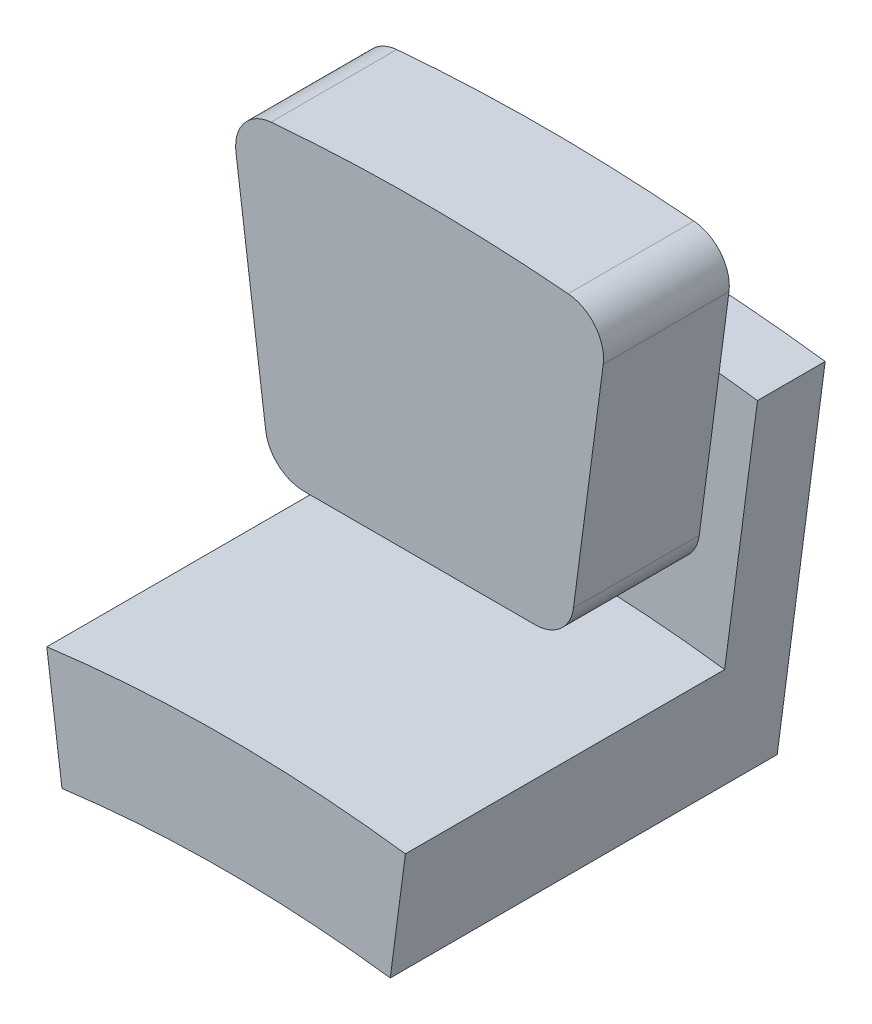
ISO-10303-21;
HEADER;
FILE_DESCRIPTION(('STEP AP214'),'2;1');
FILE_NAME('part.step','',(''),(''),'','','');
FILE_SCHEMA(('AUTOMOTIVE_DESIGN { 1 0 10303 214 1 1 1 1 }'));
ENDSEC;
DATA;
#1=APPLICATION_CONTEXT('core data for automotive mechanical design processes');
#2=APPLICATION_PROTOCOL_DEFINITION('international standard','automotive_design',2000,#1);
#3=PRODUCT_CONTEXT('',#1,'mechanical');
#4=PRODUCT('Part','Part','',(#3));
#5=PRODUCT_RELATED_PRODUCT_CATEGORY('part','',(#4));
#6=PRODUCT_DEFINITION_FORMATION('','',#4);
#7=PRODUCT_DEFINITION_CONTEXT('part definition',#1,'design');
#8=PRODUCT_DEFINITION('design','',#6,#7);
#9=PRODUCT_DEFINITION_SHAPE('','',#8);
#10=(LENGTH_UNIT() NAMED_UNIT(*) SI_UNIT(.MILLI.,.METRE.));
#11=(NAMED_UNIT(*) PLANE_ANGLE_UNIT() SI_UNIT($,.RADIAN.));
#12=(NAMED_UNIT(*) SI_UNIT($,.STERADIAN.) SOLID_ANGLE_UNIT());
#13=UNCERTAINTY_MEASURE_WITH_UNIT(LENGTH_MEASURE(1.E-05),#10,'distance_accuracy_value','');
#14=(GEOMETRIC_REPRESENTATION_CONTEXT(3) GLOBAL_UNCERTAINTY_ASSIGNED_CONTEXT((#13)) GLOBAL_UNIT_ASSIGNED_CONTEXT((#10,
#11,#12)) REPRESENTATION_CONTEXT('',''));
#15=CARTESIAN_POINT('',(0.,0.,0.));
#16=DIRECTION('',(0.,0.,1.));
#17=DIRECTION('',(1.,0.,0.));
#18=AXIS2_PLACEMENT_3D('',#15,#16,#17);
#19=CARTESIAN_POINT('',(-8.9782022166874,83.5188115633614,52.1600087497283));
#20=DIRECTION('',(0.991444861373809,0.130526192220059,0.));
#21=DIRECTION('',(-0.130526192220059,0.991444861373809,0.));
#22=AXIS2_PLACEMENT_3D('',#19,#20,#21);
#23=PLANE('',#22);
#24=DIRECTION('',(-0.130526192220052,0.99144486137381,0.));
#25=VECTOR('',#24,1.);
#26=CARTESIAN_POINT('',(-9.76156663682273,89.4690550793674,10.));
#27=LINE('',#26,#25);
#28=CARTESIAN_POINT('',(-7.95396369706912,75.7389476155599,10.));
#29=VERTEX_POINT('',#28);
#30=CARTESIAN_POINT('',(-9.4915430396612,87.4180222306949,10.));
#31=VERTEX_POINT('',#30);
#32=EDGE_CURVE('E199',#29,#31,#27,.T.);
#33=ORIENTED_EDGE('',*,*,#32,.T.);
#34=DIRECTION('',(0.,0.,-1.));
#35=VECTOR('',#34,1.);
#36=CARTESIAN_POINT('',(-9.49154303966129,87.4180222306948,52.1600087497283));
#37=LINE('',#36,#35);
#38=CARTESIAN_POINT('',(-9.49154303966119,87.4180222306949,3.50000000000002));
#39=VERTEX_POINT('',#38);
#40=EDGE_CURVE('E243',#31,#39,#37,.T.);
#41=ORIENTED_EDGE('',*,*,#40,.T.);
#42=DIRECTION('',(-0.130526192220052,0.99144486137381,0.));
#43=VECTOR('',#42,1.);
#44=CARTESIAN_POINT('',(-9.76156663682272,89.4690550793674,3.50000000000002));
#45=LINE('',#44,#43);
#46=CARTESIAN_POINT('',(-8.97820221668733,83.5188115633614,3.50000000000002));
#47=VERTEX_POINT('',#46);
#48=EDGE_CURVE('E222',#47,#39,#45,.T.);
#49=ORIENTED_EDGE('',*,*,#48,.F.);
#50=DIRECTION('',(-0.130526192220052,0.99144486137381,0.));
#51=VECTOR('',#50,1.);
#52=CARTESIAN_POINT('',(-7.72502690030701,74.,3.50000000000002));
#53=LINE('',#52,#51);
#54=CARTESIAN_POINT('',(-7.95396369706912,75.7389476155599,3.50000000000002));
#55=VERTEX_POINT('',#54);
#56=EDGE_CURVE('E183',#55,#47,#53,.T.);
#57=ORIENTED_EDGE('',*,*,#56,.F.);
#58=DIRECTION('',(0.,0.,-1.));
#59=VECTOR('',#58,1.);
#60=CARTESIAN_POINT('',(-7.95396369706914,75.7389476155599,52.1600087497283));
#61=LINE('',#60,#59);
#62=EDGE_CURVE('E235',#55,#29,#61,.F.);
#63=ORIENTED_EDGE('',*,*,#62,.T.);
#64=EDGE_LOOP('',(#33,#41,#49,#57,#63));
#65=FACE_BOUND('',#64,.T.);
#66=ADVANCED_FACE('F42',(#65),#23,.F.);
#67=CARTESIAN_POINT('',(8.9782022166874,83.5188115633614,52.1600087497283));
#68=DIRECTION('',(-0.991444861373812,0.13052619222004,0.));
#69=DIRECTION('',(-0.13052619222004,-0.991444861373812,0.));
#70=AXIS2_PLACEMENT_3D('',#67,#68,#69);
#71=PLANE('',#70);
#72=DIRECTION('',(-0.130526192220052,-0.99144486137381,0.));
#73=VECTOR('',#72,1.);
#74=CARTESIAN_POINT('',(9.76156663682273,89.4690550793674,3.50000000000002));
#75=LINE('',#74,#73);
#76=CARTESIAN_POINT('',(9.4915430396612,87.4180222306949,3.50000000000002));
#77=VERTEX_POINT('',#76);
#78=CARTESIAN_POINT('',(8.97820221668732,83.5188115633614,3.50000000000002));
#79=VERTEX_POINT('',#78);
#80=EDGE_CURVE('E173',#77,#79,#75,.T.);
#81=ORIENTED_EDGE('',*,*,#80,.F.);
#82=DIRECTION('',(0.,0.,-1.));
#83=VECTOR('',#82,1.);
#84=CARTESIAN_POINT('',(9.49154303966123,87.4180222306949,52.1600087497283));
#85=LINE('',#84,#83);
#86=CARTESIAN_POINT('',(9.4915430396612,87.4180222306949,10.));
#87=VERTEX_POINT('',#86);
#88=EDGE_CURVE('E266',#77,#87,#85,.F.);
#89=ORIENTED_EDGE('',*,*,#88,.T.);
#90=DIRECTION('',(-0.130526192220051,-0.99144486137381,0.));
#91=VECTOR('',#90,1.);
#92=CARTESIAN_POINT('',(7.72502690030703,74.,10.));
#93=LINE('',#92,#91);
#94=CARTESIAN_POINT('',(7.95396369706914,75.73894761556,10.));
#95=VERTEX_POINT('',#94);
#96=EDGE_CURVE('E193',#87,#95,#93,.T.);
#97=ORIENTED_EDGE('',*,*,#96,.T.);
#98=DIRECTION('',(0.,0.,-1.));
#99=VECTOR('',#98,1.);
#100=CARTESIAN_POINT('',(7.95396369706929,75.7389476155599,52.1600087497283));
#101=LINE('',#100,#99);
#102=CARTESIAN_POINT('',(7.95396369706914,75.73894761556,3.50000000000002));
#103=VERTEX_POINT('',#102);
#104=EDGE_CURVE('E263',#95,#103,#101,.T.);
#105=ORIENTED_EDGE('',*,*,#104,.T.);
#106=DIRECTION('',(-0.130526192220051,-0.99144486137381,0.));
#107=VECTOR('',#106,1.);
#108=CARTESIAN_POINT('',(7.72502690030703,74.,3.50000000000002));
#109=LINE('',#108,#107);
#110=EDGE_CURVE('E188',#79,#103,#109,.T.);
#111=ORIENTED_EDGE('',*,*,#110,.F.);
#112=EDGE_LOOP('',(#81,#89,#97,#105,#111));
#113=FACE_BOUND('',#112,.T.);
#114=ADVANCED_FACE('F293',(#113),#71,.F.);
#115=CARTESIAN_POINT('',(0.,0.,52.1600087497283));
#116=DIRECTION('',(0.,0.,-1.));
#117=DIRECTION('',(-1.,0.,0.));
#118=AXIS2_PLACEMENT_3D('',#115,#116,#117);
#119=CYLINDRICAL_SURFACE('',#118,90.);
#120=CARTESIAN_POINT('',(0.,0.,3.50000000000002));
#121=DIRECTION('',(0.,0.,1.));
#122=DIRECTION('',(1.,0.,0.));
#123=AXIS2_PLACEMENT_3D('',#120,#121,#122);
#124=CIRCLE('',#123,90.);
#125=CARTESIAN_POINT('',(-7.67930452866172,89.671780856388,3.50000000000002));
#126=VERTEX_POINT('',#125);
#127=CARTESIAN_POINT('',(7.67930452866164,89.6717808563881,3.50000000000002));
#128=VERTEX_POINT('',#127);
#129=EDGE_CURVE('E161',#126,#128,#124,.F.);
#130=ORIENTED_EDGE('',*,*,#129,.F.);
#131=DIRECTION('',(0.,0.,-1.));
#132=VECTOR('',#131,1.);
#133=CARTESIAN_POINT('',(-7.67930452866172,89.6717808563881,52.1600087497283));
#134=LINE('',#133,#132);
#135=CARTESIAN_POINT('',(-7.67930452866172,89.671780856388,10.));
#136=VERTEX_POINT('',#135);
#137=EDGE_CURVE('E253',#126,#136,#134,.F.);
#138=ORIENTED_EDGE('',*,*,#137,.T.);
#139=CARTESIAN_POINT('',(0.,0.,10.));
#140=DIRECTION('',(0.,0.,1.));
#141=DIRECTION('',(1.,0.,0.));
#142=AXIS2_PLACEMENT_3D('',#139,#140,#141);
#143=CIRCLE('',#142,90.);
#144=CARTESIAN_POINT('',(7.67930452866164,89.6717808563881,10.));
#145=VERTEX_POINT('',#144);
#146=EDGE_CURVE('E196',#136,#145,#143,.F.);
#147=ORIENTED_EDGE('',*,*,#146,.T.);
#148=DIRECTION('',(0.,0.,-1.));
#149=VECTOR('',#148,1.);
#150=CARTESIAN_POINT('',(7.67930452866164,89.6717808563881,52.1600087497283));
#151=LINE('',#150,#149);
#152=EDGE_CURVE('E250',#145,#128,#151,.T.);
#153=ORIENTED_EDGE('',*,*,#152,.T.);
#154=EDGE_LOOP('',(#130,#138,#147,#153));
#155=FACE_BOUND('',#154,.T.);
#156=ADVANCED_FACE('F302',(#155),#119,.T.);
#157=CARTESIAN_POINT('',(7.72502690030703,74.,-16.2550149550945));
#158=DIRECTION('',(0.,1.,0.));
#159=DIRECTION('',(0.,0.,1.));
#160=AXIS2_PLACEMENT_3D('',#157,#158,#159);
#161=PLANE('',#160);
#162=DIRECTION('',(-1.,0.,0.));
#163=VECTOR('',#162,1.);
#164=CARTESIAN_POINT('',(-7.72502690030701,74.,10.));
#165=LINE('',#164,#163);
#166=CARTESIAN_POINT('',(5.97107397432167,74.,10.));
#167=VERTEX_POINT('',#166);
#168=CARTESIAN_POINT('',(-5.97107397432152,74.,10.));
#169=VERTEX_POINT('',#168);
#170=EDGE_CURVE('E202',#167,#169,#165,.T.);
#171=ORIENTED_EDGE('',*,*,#170,.T.);
#172=DIRECTION('',(0.,0.,-1.));
#173=VECTOR('',#172,1.);
#174=CARTESIAN_POINT('',(-5.97107397432152,74.,-16.2550149550945));
#175=LINE('',#174,#173);
#176=CARTESIAN_POINT('',(-5.97107397432152,74.,3.50000000000002));
#177=VERTEX_POINT('',#176);
#178=EDGE_CURVE('E270',#169,#177,#175,.T.);
#179=ORIENTED_EDGE('',*,*,#178,.T.);
#180=DIRECTION('',(1.,0.,0.));
#181=VECTOR('',#180,1.);
#182=CARTESIAN_POINT('',(7.72502690030703,74.,3.50000000000002));
#183=LINE('',#182,#181);
#184=CARTESIAN_POINT('',(5.97107397432167,74.,3.50000000000002));
#185=VERTEX_POINT('',#184);
#186=EDGE_CURVE('E213',#177,#185,#183,.T.);
#187=ORIENTED_EDGE('',*,*,#186,.T.);
#188=DIRECTION('',(0.,0.,-1.));
#189=VECTOR('',#188,1.);
#190=CARTESIAN_POINT('',(5.97107397432167,74.,-16.2550149550945));
#191=LINE('',#190,#189);
#192=EDGE_CURVE('E268',#185,#167,#191,.F.);
#193=ORIENTED_EDGE('',*,*,#192,.T.);
#194=EDGE_LOOP('',(#171,#179,#187,#193));
#195=FACE_BOUND('',#194,.T.);
#196=ADVANCED_FACE('F285',(#195),#161,.F.);
#197=CARTESIAN_POINT('',(0.,0.,20.));
#198=DIRECTION('',(0.,0.,1.));
#199=DIRECTION('',(1.,0.,0.));
#200=AXIS2_PLACEMENT_3D('',#197,#198,#199);
#201=PLANE('',#200);
#202=CARTESIAN_POINT('',(0.,0.,20.));
#203=DIRECTION('',(0.,0.,-1.));
#204=DIRECTION('',(1.,0.,0.));
#205=AXIS2_PLACEMENT_3D('',#202,#203,#204);
#206=CIRCLE('',#205,71.);
#207=CARTESIAN_POINT('',(-9.26735964762369,70.3925851575405,20.));
#208=VERTEX_POINT('',#207);
#209=CARTESIAN_POINT('',(9.2673596476237,70.3925851575405,20.));
#210=VERTEX_POINT('',#209);
#211=EDGE_CURVE('E205',#208,#210,#206,.T.);
#212=ORIENTED_EDGE('',*,*,#211,.F.);
#213=DIRECTION('',(0.130526192220052,-0.99144486137381,0.));
#214=VECTOR('',#213,1.);
#215=CARTESIAN_POINT('',(-8.48420249430338,64.4439159892977,20.));
#216=LINE('',#215,#214);
#217=CARTESIAN_POINT('',(-8.48420249430338,64.4439159892977,20.));
#218=VERTEX_POINT('',#217);
#219=EDGE_CURVE('E229',#208,#218,#216,.T.);
#220=ORIENTED_EDGE('',*,*,#219,.T.);
#221=CARTESIAN_POINT('',(0.,0.,20.));
#222=DIRECTION('',(0.,0.,1.));
#223=DIRECTION('',(1.,0.,0.));
#224=AXIS2_PLACEMENT_3D('',#221,#222,#223);
#225=CIRCLE('',#224,65.);
#226=CARTESIAN_POINT('',(8.48420249430338,64.4439159892977,20.));
#227=VERTEX_POINT('',#226);
#228=EDGE_CURVE('E236',#218,#227,#225,.F.);
#229=ORIENTED_EDGE('',*,*,#228,.T.);
#230=DIRECTION('',(0.130526192220052,0.99144486137381,0.));
#231=VECTOR('',#230,1.);
#232=CARTESIAN_POINT('',(8.48420249430338,64.4439159892977,20.));
#233=LINE('',#232,#231);
#234=EDGE_CURVE('E232',#227,#210,#233,.T.);
#235=ORIENTED_EDGE('',*,*,#234,.T.);
#236=EDGE_LOOP('',(#212,#220,#229,#235));
#237=FACE_BOUND('',#236,.T.);
#238=ADVANCED_FACE('F318',(#237),#201,.T.);
#239=CARTESIAN_POINT('',(-8.48420249430338,64.4439159892977,52.1600087497283));
#240=DIRECTION('',(0.99144486137381,0.130526192220052,0.));
#241=DIRECTION('',(-0.130526192220052,0.99144486137381,0.));
#242=AXIS2_PLACEMENT_3D('',#239,#240,#241);
#243=PLANE('',#242);
#244=ORIENTED_EDGE('',*,*,#219,.F.);
#245=DIRECTION('',(0.,0.,1.));
#246=VECTOR('',#245,1.);
#247=CARTESIAN_POINT('',(-9.26735964762369,70.3925851575405,-16.2550149550945));
#248=LINE('',#247,#246);
#249=CARTESIAN_POINT('',(-9.26735964762369,70.3925851575405,3.50000000000002));
#250=VERTEX_POINT('',#249);
#251=EDGE_CURVE('E215',#250,#208,#248,.T.);
#252=ORIENTED_EDGE('',*,*,#251,.F.);
#253=DIRECTION('',(-0.130526192220054,0.99144486137381,0.));
#254=VECTOR('',#253,1.);
#255=CARTESIAN_POINT('',(-9.26735964762369,70.3925851575405,3.50000000000002));
#256=LINE('',#255,#254);
#257=CARTESIAN_POINT('',(-10.9642001464844,83.2813683554001,3.50000000000002));
#258=VERTEX_POINT('',#257);
#259=EDGE_CURVE('E180',#250,#258,#256,.T.);
#260=ORIENTED_EDGE('',*,*,#259,.T.);
#261=DIRECTION('',(0.,0.,1.));
#262=VECTOR('',#261,1.);
#263=CARTESIAN_POINT('',(-10.9642001464844,83.2813683554001,-10.2770283892811));
#264=LINE('',#263,#262);
#265=CARTESIAN_POINT('',(-10.9642001464844,83.2813683554001,0.));
#266=VERTEX_POINT('',#265);
#267=EDGE_CURVE('E168',#266,#258,#264,.T.);
#268=ORIENTED_EDGE('',*,*,#267,.F.);
#269=DIRECTION('',(0.130526192220052,-0.99144486137381,0.));
#270=VECTOR('',#269,1.);
#271=CARTESIAN_POINT('',(-8.48420249430338,64.4439159892977,0.));
#272=LINE('',#271,#270);
#273=CARTESIAN_POINT('',(-8.48420249430338,64.4439159892977,0.));
#274=VERTEX_POINT('',#273);
#275=EDGE_CURVE('E149',#266,#274,#272,.T.);
#276=ORIENTED_EDGE('',*,*,#275,.T.);
#277=DIRECTION('',(0.,0.,-1.));
#278=VECTOR('',#277,1.);
#279=CARTESIAN_POINT('',(-8.48420249430338,64.4439159892977,52.1600087497283));
#280=LINE('',#279,#278);
#281=EDGE_CURVE('E160',#218,#274,#280,.T.);
#282=ORIENTED_EDGE('',*,*,#281,.F.);
#283=EDGE_LOOP('',(#244,#252,#260,#268,#276,#282));
#284=FACE_BOUND('',#283,.T.);
#285=ADVANCED_FACE('F177',(#284),#243,.F.);
#286=CARTESIAN_POINT('',(0.,0.,52.1600087497283));
#287=DIRECTION('',(0.,0.,-1.));
#288=DIRECTION('',(-1.,0.,0.));
#289=AXIS2_PLACEMENT_3D('',#286,#287,#288);
#290=CYLINDRICAL_SURFACE('',#289,65.);
#291=ORIENTED_EDGE('',*,*,#228,.F.);
#292=ORIENTED_EDGE('',*,*,#281,.T.);
#293=CARTESIAN_POINT('',(0.,0.,0.));
#294=DIRECTION('',(0.,0.,-1.));
#295=DIRECTION('',(-1.,0.,0.));
#296=AXIS2_PLACEMENT_3D('',#293,#294,#295);
#297=CIRCLE('',#296,65.);
#298=CARTESIAN_POINT('',(8.48420249430338,64.4439159892977,0.));
#299=VERTEX_POINT('',#298);
#300=EDGE_CURVE('E156',#274,#299,#297,.T.);
#301=ORIENTED_EDGE('',*,*,#300,.T.);
#302=DIRECTION('',(0.,0.,-1.));
#303=VECTOR('',#302,1.);
#304=CARTESIAN_POINT('',(8.48420249430338,64.4439159892977,52.1600087497283));
#305=LINE('',#304,#303);
#306=EDGE_CURVE('E230',#227,#299,#305,.T.);
#307=ORIENTED_EDGE('',*,*,#306,.F.);
#308=EDGE_LOOP('',(#291,#292,#301,#307));
#309=FACE_BOUND('',#308,.T.);
#310=ADVANCED_FACE('F315',(#309),#290,.F.);
#311=CARTESIAN_POINT('',(8.48420249430338,64.4439159892977,52.1600087497283));
#312=DIRECTION('',(-0.99144486137381,0.130526192220052,0.));
#313=DIRECTION('',(-0.130526192220052,-0.99144486137381,0.));
#314=AXIS2_PLACEMENT_3D('',#311,#312,#313);
#315=PLANE('',#314);
#316=DIRECTION('',(-0.130526192220052,-0.99144486137381,0.));
#317=VECTOR('',#316,1.);
#318=CARTESIAN_POINT('',(9.2673596476237,70.3925851575405,3.50000000000002));
#319=LINE('',#318,#317);
#320=CARTESIAN_POINT('',(10.9642001464843,83.2813683554001,3.50000000000002));
#321=VERTEX_POINT('',#320);
#322=CARTESIAN_POINT('',(9.2673596476237,70.3925851575405,3.50000000000002));
#323=VERTEX_POINT('',#322);
#324=EDGE_CURVE('E210',#321,#323,#319,.T.);
#325=ORIENTED_EDGE('',*,*,#324,.T.);
#326=DIRECTION('',(0.,0.,1.));
#327=VECTOR('',#326,1.);
#328=CARTESIAN_POINT('',(9.2673596476237,70.3925851575405,-16.2550149550945));
#329=LINE('',#328,#327);
#330=EDGE_CURVE('E208',#323,#210,#329,.T.);
#331=ORIENTED_EDGE('',*,*,#330,.T.);
#332=ORIENTED_EDGE('',*,*,#234,.F.);
#333=ORIENTED_EDGE('',*,*,#306,.T.);
#334=DIRECTION('',(0.130526192220052,0.99144486137381,0.));
#335=VECTOR('',#334,1.);
#336=CARTESIAN_POINT('',(8.48420249430338,64.4439159892977,0.));
#337=LINE('',#336,#335);
#338=CARTESIAN_POINT('',(10.9642001464843,83.2813683554001,0.));
#339=VERTEX_POINT('',#338);
#340=EDGE_CURVE('E227',#299,#339,#337,.T.);
#341=ORIENTED_EDGE('',*,*,#340,.T.);
#342=DIRECTION('',(0.,0.,1.));
#343=VECTOR('',#342,1.);
#344=CARTESIAN_POINT('',(10.9642001464843,83.2813683554001,-10.2770283892811));
#345=LINE('',#344,#343);
#346=EDGE_CURVE('E172',#339,#321,#345,.T.);
#347=ORIENTED_EDGE('',*,*,#346,.T.);
#348=EDGE_LOOP('',(#325,#331,#332,#333,#341,#347));
#349=FACE_BOUND('',#348,.T.);
#350=ADVANCED_FACE('F311',(#349),#315,.F.);
#351=CARTESIAN_POINT('',(0.,0.,0.));
#352=DIRECTION('',(0.,0.,-1.));
#353=DIRECTION('',(-1.,0.,0.));
#354=AXIS2_PLACEMENT_3D('',#351,#352,#353);
#355=PLANE('',#354);
#356=CARTESIAN_POINT('',(0.,0.,0.));
#357=DIRECTION('',(0.,0.,1.));
#358=DIRECTION('',(-1.,0.,0.));
#359=AXIS2_PLACEMENT_3D('',#356,#357,#358);
#360=CIRCLE('',#359,84.);
#361=EDGE_CURVE('E153',#339,#266,#360,.T.);
#362=ORIENTED_EDGE('',*,*,#361,.F.);
#363=ORIENTED_EDGE('',*,*,#340,.F.);
#364=ORIENTED_EDGE('',*,*,#300,.F.);
#365=ORIENTED_EDGE('',*,*,#275,.F.);
#366=EDGE_LOOP('',(#362,#363,#364,#365));
#367=FACE_BOUND('',#366,.T.);
#368=ADVANCED_FACE('F151',(#367),#355,.T.);
#369=CARTESIAN_POINT('',(84.,0.,3.50000000000002));
#370=DIRECTION('',(0.,0.,1.));
#371=DIRECTION('',(0.,-1.,0.));
#372=AXIS2_PLACEMENT_3D('',#369,#370,#371);
#373=PLANE('',#372);
#374=ORIENTED_EDGE('',*,*,#48,.T.);
#375=CARTESIAN_POINT('',(-7.50865331691368,87.679074615135,3.50000000000002));
#376=DIRECTION('',(0.,0.,1.));
#377=DIRECTION('',(1.,0.,0.));
#378=AXIS2_PLACEMENT_3D('',#375,#376,#377);
#379=CIRCLE('',#378,2.);
#380=EDGE_CURVE('E248',#39,#126,#379,.F.);
#381=ORIENTED_EDGE('',*,*,#380,.T.);
#382=ORIENTED_EDGE('',*,*,#129,.T.);
#383=CARTESIAN_POINT('',(7.5086533169136,87.679074615135,3.50000000000002));
#384=DIRECTION('',(0.,0.,1.));
#385=DIRECTION('',(1.,0.,0.));
#386=AXIS2_PLACEMENT_3D('',#383,#384,#385);
#387=CIRCLE('',#386,2.);
#388=EDGE_CURVE('E246',#128,#77,#387,.F.);
#389=ORIENTED_EDGE('',*,*,#388,.T.);
#390=ORIENTED_EDGE('',*,*,#80,.T.);
#391=CARTESIAN_POINT('',(0.,0.,3.50000000000002));
#392=DIRECTION('',(0.,0.,-1.));
#393=DIRECTION('',(0.,1.,0.));
#394=AXIS2_PLACEMENT_3D('',#391,#392,#393);
#395=CIRCLE('',#394,84.);
#396=EDGE_CURVE('E174',#47,#79,#395,.T.);
#397=ORIENTED_EDGE('',*,*,#396,.F.);
#398=EDGE_LOOP('',(#374,#381,#382,#389,#390,#397));
#399=FACE_BOUND('',#398,.T.);
#400=ADVANCED_FACE('F308',(#399),#373,.F.);
#401=CARTESIAN_POINT('',(0.,0.,24.070817591232));
#402=DIRECTION('',(0.,0.,-1.));
#403=DIRECTION('',(-1.,0.,0.));
#404=AXIS2_PLACEMENT_3D('',#401,#402,#403);
#405=CYLINDRICAL_SURFACE('',#404,84.);
#406=ORIENTED_EDGE('',*,*,#396,.T.);
#407=CARTESIAN_POINT('',(0.,0.,3.50000000000002));
#408=DIRECTION('',(0.,0.,1.));
#409=DIRECTION('',(1.,0.,0.));
#410=AXIS2_PLACEMENT_3D('',#407,#408,#409);
#411=CIRCLE('',#410,84.);
#412=EDGE_CURVE('E186',#321,#79,#411,.T.);
#413=ORIENTED_EDGE('',*,*,#412,.F.);
#414=ORIENTED_EDGE('',*,*,#346,.F.);
#415=ORIENTED_EDGE('',*,*,#361,.T.);
#416=ORIENTED_EDGE('',*,*,#267,.T.);
#417=CARTESIAN_POINT('',(0.,0.,3.50000000000002));
#418=DIRECTION('',(0.,0.,1.));
#419=DIRECTION('',(1.,0.,0.));
#420=AXIS2_PLACEMENT_3D('',#417,#418,#419);
#421=CIRCLE('',#420,84.);
#422=EDGE_CURVE('E181',#47,#258,#421,.T.);
#423=ORIENTED_EDGE('',*,*,#422,.F.);
#424=EDGE_LOOP('',(#406,#413,#414,#415,#416,#423));
#425=FACE_BOUND('',#424,.T.);
#426=ADVANCED_FACE('F166',(#425),#405,.T.);
#427=CARTESIAN_POINT('',(0.,0.,-16.2550149550945));
#428=DIRECTION('',(0.,0.,1.));
#429=DIRECTION('',(1.,0.,0.));
#430=AXIS2_PLACEMENT_3D('',#427,#428,#429);
#431=CYLINDRICAL_SURFACE('',#430,71.);
#432=CARTESIAN_POINT('',(0.,0.,3.50000000000002));
#433=DIRECTION('',(0.,0.,1.));
#434=DIRECTION('',(1.,0.,0.));
#435=AXIS2_PLACEMENT_3D('',#432,#433,#434);
#436=CIRCLE('',#435,71.);
#437=EDGE_CURVE('E207',#323,#250,#436,.T.);
#438=ORIENTED_EDGE('',*,*,#437,.T.);
#439=ORIENTED_EDGE('',*,*,#251,.T.);
#440=ORIENTED_EDGE('',*,*,#211,.T.);
#441=ORIENTED_EDGE('',*,*,#330,.F.);
#442=EDGE_LOOP('',(#438,#439,#440,#441));
#443=FACE_BOUND('',#442,.T.);
#444=ADVANCED_FACE('F320',(#443),#431,.T.);
#445=CARTESIAN_POINT('',(84.,0.,3.50000000000002));
#446=DIRECTION('',(0.,0.,1.));
#447=DIRECTION('',(0.,-1.,0.));
#448=AXIS2_PLACEMENT_3D('',#445,#446,#447);
#449=PLANE('',#448);
#450=ORIENTED_EDGE('',*,*,#324,.F.);
#451=ORIENTED_EDGE('',*,*,#412,.T.);
#452=ORIENTED_EDGE('',*,*,#110,.T.);
#453=CARTESIAN_POINT('',(5.97107397432167,76.,3.50000000000002));
#454=DIRECTION('',(0.,0.,1.));
#455=DIRECTION('',(1.,0.,0.));
#456=AXIS2_PLACEMENT_3D('',#453,#454,#455);
#457=CIRCLE('',#456,2.);
#458=EDGE_CURVE('E12',#103,#185,#457,.F.);
#459=ORIENTED_EDGE('',*,*,#458,.T.);
#460=ORIENTED_EDGE('',*,*,#186,.F.);
#461=CARTESIAN_POINT('',(-5.97107397432152,76.,3.50000000000002));
#462=DIRECTION('',(0.,0.,1.));
#463=DIRECTION('',(1.,0.,0.));
#464=AXIS2_PLACEMENT_3D('',#461,#462,#463);
#465=CIRCLE('',#464,2.);
#466=EDGE_CURVE('E50',#177,#55,#465,.F.);
#467=ORIENTED_EDGE('',*,*,#466,.T.);
#468=ORIENTED_EDGE('',*,*,#56,.T.);
#469=ORIENTED_EDGE('',*,*,#422,.T.);
#470=ORIENTED_EDGE('',*,*,#259,.F.);
#471=ORIENTED_EDGE('',*,*,#437,.F.);
#472=EDGE_LOOP('',(#450,#451,#452,#459,#460,#467,#468,#469,#470,#471));
#473=FACE_BOUND('',#472,.T.);
#474=ADVANCED_FACE('F272',(#473),#449,.T.);
#475=CARTESIAN_POINT('',(0.,0.,10.));
#476=DIRECTION('',(0.,0.,1.));
#477=DIRECTION('',(1.,0.,0.));
#478=AXIS2_PLACEMENT_3D('',#475,#476,#477);
#479=PLANE('',#478);
#480=ORIENTED_EDGE('',*,*,#146,.F.);
#481=CARTESIAN_POINT('',(-7.50865331691368,87.679074615135,10.));
#482=DIRECTION('',(0.,0.,1.));
#483=DIRECTION('',(1.,0.,0.));
#484=AXIS2_PLACEMENT_3D('',#481,#482,#483);
#485=CIRCLE('',#484,2.);
#486=EDGE_CURVE('E261',#136,#31,#485,.T.);
#487=ORIENTED_EDGE('',*,*,#486,.T.);
#488=ORIENTED_EDGE('',*,*,#32,.F.);
#489=CARTESIAN_POINT('',(-5.97107397432152,76.,10.));
#490=DIRECTION('',(0.,0.,1.));
#491=DIRECTION('',(1.,0.,0.));
#492=AXIS2_PLACEMENT_3D('',#489,#490,#491);
#493=CIRCLE('',#492,2.);
#494=EDGE_CURVE('E257',#29,#169,#493,.T.);
#495=ORIENTED_EDGE('',*,*,#494,.T.);
#496=ORIENTED_EDGE('',*,*,#170,.F.);
#497=CARTESIAN_POINT('',(5.97107397432167,76.,10.));
#498=DIRECTION('',(0.,0.,1.));
#499=DIRECTION('',(1.,0.,0.));
#500=AXIS2_PLACEMENT_3D('',#497,#498,#499);
#501=CIRCLE('',#500,2.);
#502=EDGE_CURVE('E255',#167,#95,#501,.T.);
#503=ORIENTED_EDGE('',*,*,#502,.T.);
#504=ORIENTED_EDGE('',*,*,#96,.F.);
#505=CARTESIAN_POINT('',(7.5086533169136,87.679074615135,10.));
#506=DIRECTION('',(0.,0.,1.));
#507=DIRECTION('',(1.,0.,0.));
#508=AXIS2_PLACEMENT_3D('',#505,#506,#507);
#509=CIRCLE('',#508,2.);
#510=EDGE_CURVE('E259',#87,#145,#509,.T.);
#511=ORIENTED_EDGE('',*,*,#510,.T.);
#512=EDGE_LOOP('',(#480,#487,#488,#495,#496,#503,#504,#511));
#513=FACE_BOUND('',#512,.T.);
#514=ADVANCED_FACE('F282',(#513),#479,.T.);
#515=CARTESIAN_POINT('',(-7.50865331691368,87.679074615135,52.1600087497283));
#516=DIRECTION('',(0.,0.,-1.));
#517=DIRECTION('',(-1.,0.,0.));
#518=AXIS2_PLACEMENT_3D('',#515,#516,#517);
#519=CYLINDRICAL_SURFACE('',#518,2.);
#520=ORIENTED_EDGE('',*,*,#486,.F.);
#521=ORIENTED_EDGE('',*,*,#137,.F.);
#522=ORIENTED_EDGE('',*,*,#380,.F.);
#523=ORIENTED_EDGE('',*,*,#40,.F.);
#524=EDGE_LOOP('',(#520,#521,#522,#523));
#525=FACE_BOUND('',#524,.T.);
#526=ADVANCED_FACE('F305',(#525),#519,.T.);
#527=CARTESIAN_POINT('',(7.5086533169136,87.679074615135,52.1600087497283));
#528=DIRECTION('',(0.,0.,-1.));
#529=DIRECTION('',(-1.,0.,0.));
#530=AXIS2_PLACEMENT_3D('',#527,#528,#529);
#531=CYLINDRICAL_SURFACE('',#530,2.);
#532=ORIENTED_EDGE('',*,*,#510,.F.);
#533=ORIENTED_EDGE('',*,*,#88,.F.);
#534=ORIENTED_EDGE('',*,*,#388,.F.);
#535=ORIENTED_EDGE('',*,*,#152,.F.);
#536=EDGE_LOOP('',(#532,#533,#534,#535));
#537=FACE_BOUND('',#536,.T.);
#538=ADVANCED_FACE('F297',(#537),#531,.T.);
#539=CARTESIAN_POINT('',(-5.97107397432152,76.,-16.2550149550945));
#540=DIRECTION('',(0.,0.,-1.));
#541=DIRECTION('',(-1.,0.,0.));
#542=AXIS2_PLACEMENT_3D('',#539,#540,#541);
#543=CYLINDRICAL_SURFACE('',#542,2.);
#544=ORIENTED_EDGE('',*,*,#494,.F.);
#545=ORIENTED_EDGE('',*,*,#62,.F.);
#546=ORIENTED_EDGE('',*,*,#466,.F.);
#547=ORIENTED_EDGE('',*,*,#178,.F.);
#548=EDGE_LOOP('',(#544,#545,#546,#547));
#549=FACE_BOUND('',#548,.T.);
#550=ADVANCED_FACE('F278',(#549),#543,.T.);
#551=CARTESIAN_POINT('',(5.97107397432167,76.,52.1600087497283));
#552=DIRECTION('',(0.,0.,-1.));
#553=DIRECTION('',(-1.,0.,0.));
#554=AXIS2_PLACEMENT_3D('',#551,#552,#553);
#555=CYLINDRICAL_SURFACE('',#554,2.);
#556=ORIENTED_EDGE('',*,*,#502,.F.);
#557=ORIENTED_EDGE('',*,*,#192,.F.);
#558=ORIENTED_EDGE('',*,*,#458,.F.);
#559=ORIENTED_EDGE('',*,*,#104,.F.);
#560=EDGE_LOOP('',(#556,#557,#558,#559));
#561=FACE_BOUND('',#560,.T.);
#562=ADVANCED_FACE('F44',(#561),#555,.T.);
#563=CLOSED_SHELL('',(#66,#114,#156,#196,#238,#285,#310,#350,#368,#400,#426,#444,#474,#514,#526,
#538,#550,#562));
#564=MANIFOLD_SOLID_BREP('B2',#563);
#565=ADVANCED_BREP_SHAPE_REPRESENTATION('',(#18,#564),#14);
#566=SHAPE_DEFINITION_REPRESENTATION(#9,#565);
ENDSEC;
END-ISO-10303-21;
